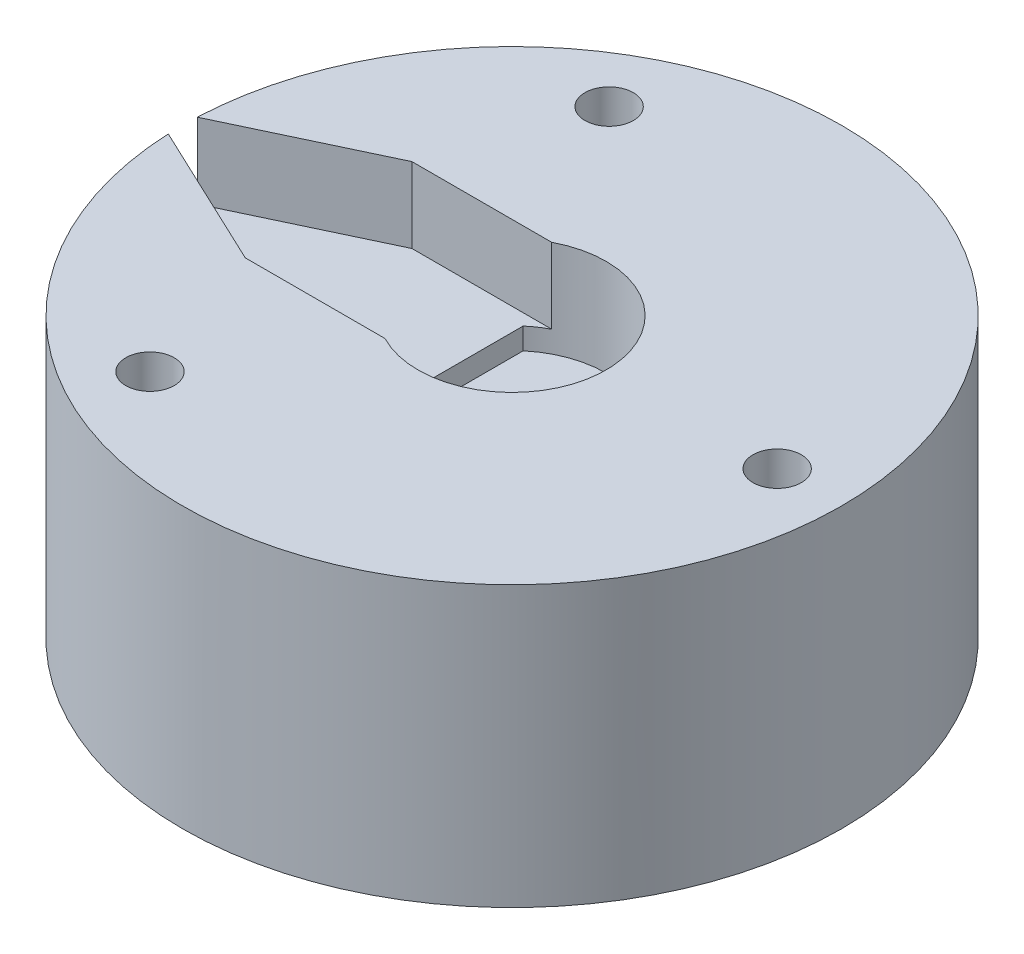
ISO-10303-21;
HEADER;
FILE_DESCRIPTION(('STEP AP214'),'2;1');
FILE_NAME('part.step','',(''),(''),'','','');
FILE_SCHEMA(('AUTOMOTIVE_DESIGN { 1 0 10303 214 1 1 1 1 }'));
ENDSEC;
DATA;
#1=APPLICATION_CONTEXT('core data for automotive mechanical design processes');
#2=APPLICATION_PROTOCOL_DEFINITION('international standard','automotive_design',2000,#1);
#3=PRODUCT_CONTEXT('',#1,'mechanical');
#4=PRODUCT('Part','Part','',(#3));
#5=PRODUCT_RELATED_PRODUCT_CATEGORY('part','',(#4));
#6=PRODUCT_DEFINITION_FORMATION('','',#4);
#7=PRODUCT_DEFINITION_CONTEXT('part definition',#1,'design');
#8=PRODUCT_DEFINITION('design','',#6,#7);
#9=PRODUCT_DEFINITION_SHAPE('','',#8);
#10=(LENGTH_UNIT() NAMED_UNIT(*) SI_UNIT(.MILLI.,.METRE.));
#11=(NAMED_UNIT(*) PLANE_ANGLE_UNIT() SI_UNIT($,.RADIAN.));
#12=(NAMED_UNIT(*) SI_UNIT($,.STERADIAN.) SOLID_ANGLE_UNIT());
#13=UNCERTAINTY_MEASURE_WITH_UNIT(LENGTH_MEASURE(1.E-05),#10,'distance_accuracy_value','');
#14=(GEOMETRIC_REPRESENTATION_CONTEXT(3) GLOBAL_UNCERTAINTY_ASSIGNED_CONTEXT((#13)) GLOBAL_UNIT_ASSIGNED_CONTEXT((#10,
#11,#12)) REPRESENTATION_CONTEXT('',''));
#15=CARTESIAN_POINT('',(0.,0.,0.));
#16=DIRECTION('',(0.,0.,1.));
#17=DIRECTION('',(1.,0.,0.));
#18=AXIS2_PLACEMENT_3D('',#15,#16,#17);
#19=CARTESIAN_POINT('',(0.,0.,0.));
#20=DIRECTION('',(0.,-1.,0.));
#21=DIRECTION('',(0.,0.,-1.));
#22=AXIS2_PLACEMENT_3D('',#19,#20,#21);
#23=CYLINDRICAL_SURFACE('',#22,30.65);
#24=CARTESIAN_POINT('',(0.,0.,0.));
#25=DIRECTION('',(0.,-1.,0.));
#26=DIRECTION('',(0.,0.,-1.));
#27=AXIS2_PLACEMENT_3D('',#24,#25,#26);
#28=CIRCLE('',#27,30.65);
#29=CARTESIAN_POINT('',(0.,0.,-30.65));
#30=VERTEX_POINT('',#29);
#31=EDGE_CURVE('E11',#30,#30,#28,.T.);
#32=ORIENTED_EDGE('',*,*,#31,.F.);
#33=EDGE_LOOP('',(#32));
#34=FACE_BOUND('',#33,.T.);
#35=CARTESIAN_POINT('',(0.,26.,0.));
#36=DIRECTION('',(0.,-1.,0.));
#37=DIRECTION('',(0.,0.,-1.));
#38=AXIS2_PLACEMENT_3D('',#35,#36,#37);
#39=CIRCLE('',#38,30.65);
#40=CARTESIAN_POINT('',(-30.6202547344074,26.,-1.35));
#41=VERTEX_POINT('',#40);
#42=CARTESIAN_POINT('',(-30.6202547344074,26.,1.35));
#43=VERTEX_POINT('',#42);
#44=EDGE_CURVE('E187',#41,#43,#39,.T.);
#45=ORIENTED_EDGE('',*,*,#44,.T.);
#46=DIRECTION('',(0.,1.,0.));
#47=VECTOR('',#46,1.);
#48=CARTESIAN_POINT('',(-30.6202547344074,19.,1.35));
#49=LINE('',#48,#47);
#50=CARTESIAN_POINT('',(-30.6202547344074,19.,1.35));
#51=VERTEX_POINT('',#50);
#52=EDGE_CURVE('E246',#51,#43,#49,.T.);
#53=ORIENTED_EDGE('',*,*,#52,.F.);
#54=CARTESIAN_POINT('',(0.,19.,0.));
#55=DIRECTION('',(0.,1.,0.));
#56=DIRECTION('',(0.,0.,1.));
#57=AXIS2_PLACEMENT_3D('',#54,#55,#56);
#58=CIRCLE('',#57,30.65);
#59=CARTESIAN_POINT('',(-30.6202547344074,19.,-1.35));
#60=VERTEX_POINT('',#59);
#61=EDGE_CURVE('E375',#60,#51,#58,.T.);
#62=ORIENTED_EDGE('',*,*,#61,.F.);
#63=DIRECTION('',(0.,1.,0.));
#64=VECTOR('',#63,1.);
#65=CARTESIAN_POINT('',(-30.6202547344074,19.,-1.35));
#66=LINE('',#65,#64);
#67=EDGE_CURVE('E247',#60,#41,#66,.T.);
#68=ORIENTED_EDGE('',*,*,#67,.T.);
#69=EDGE_LOOP('',(#45,#53,#62,#68));
#70=FACE_BOUND('',#69,.T.);
#71=ADVANCED_FACE('F36',(#34,#70),#23,.T.);
#72=CARTESIAN_POINT('',(5.65,17.,0.));
#73=DIRECTION('',(-1.,0.,0.));
#74=DIRECTION('',(0.,0.,1.));
#75=AXIS2_PLACEMENT_3D('',#72,#73,#74);
#76=PLANE('',#75);
#77=DIRECTION('',(0.,1.,0.));
#78=VECTOR('',#77,1.);
#79=CARTESIAN_POINT('',(5.65,17.,6.68131723539602));
#80=LINE('',#79,#78);
#81=CARTESIAN_POINT('',(5.65,17.,6.68131723539602));
#82=VERTEX_POINT('',#81);
#83=CARTESIAN_POINT('',(5.65,19.,6.68131723539602));
#84=VERTEX_POINT('',#83);
#85=EDGE_CURVE('E174',#82,#84,#80,.T.);
#86=ORIENTED_EDGE('',*,*,#85,.T.);
#87=DIRECTION('',(0.,0.,1.));
#88=VECTOR('',#87,1.);
#89=CARTESIAN_POINT('',(5.65,19.,0.));
#90=LINE('',#89,#88);
#91=CARTESIAN_POINT('',(5.65,19.,-6.68131723539603));
#92=VERTEX_POINT('',#91);
#93=EDGE_CURVE('E160',#92,#84,#90,.T.);
#94=ORIENTED_EDGE('',*,*,#93,.F.);
#95=DIRECTION('',(0.,1.,0.));
#96=VECTOR('',#95,1.);
#97=CARTESIAN_POINT('',(5.65,17.,-6.68131723539603));
#98=LINE('',#97,#96);
#99=CARTESIAN_POINT('',(5.65,17.,-6.68131723539603));
#100=VERTEX_POINT('',#99);
#101=EDGE_CURVE('E176',#100,#92,#98,.T.);
#102=ORIENTED_EDGE('',*,*,#101,.F.);
#103=DIRECTION('',(0.,0.,1.));
#104=VECTOR('',#103,1.);
#105=CARTESIAN_POINT('',(5.65,17.,0.));
#106=LINE('',#105,#104);
#107=EDGE_CURVE('E182',#100,#82,#106,.T.);
#108=ORIENTED_EDGE('',*,*,#107,.T.);
#109=EDGE_LOOP('',(#86,#94,#102,#108));
#110=FACE_BOUND('',#109,.T.);
#111=ADVANCED_FACE('F180',(#110),#76,.T.);
#112=CARTESIAN_POINT('',(-5.65,17.,0.));
#113=DIRECTION('',(-1.,0.,0.));
#114=DIRECTION('',(0.,0.,1.));
#115=AXIS2_PLACEMENT_3D('',#112,#113,#114);
#116=PLANE('',#115);
#117=DIRECTION('',(0.,0.,1.));
#118=VECTOR('',#117,1.);
#119=CARTESIAN_POINT('',(-5.65,19.,0.));
#120=LINE('',#119,#118);
#121=CARTESIAN_POINT('',(-5.65,19.,-6.68131723539603));
#122=VERTEX_POINT('',#121);
#123=CARTESIAN_POINT('',(-5.65,19.,6.68131723539603));
#124=VERTEX_POINT('',#123);
#125=EDGE_CURVE('E50',#122,#124,#120,.T.);
#126=ORIENTED_EDGE('',*,*,#125,.T.);
#127=DIRECTION('',(0.,1.,0.));
#128=VECTOR('',#127,1.);
#129=CARTESIAN_POINT('',(-5.65,17.,6.68131723539603));
#130=LINE('',#129,#128);
#131=CARTESIAN_POINT('',(-5.65,17.,6.68131723539603));
#132=VERTEX_POINT('',#131);
#133=EDGE_CURVE('E184',#132,#124,#130,.T.);
#134=ORIENTED_EDGE('',*,*,#133,.F.);
#135=DIRECTION('',(0.,0.,1.));
#136=VECTOR('',#135,1.);
#137=CARTESIAN_POINT('',(-5.65,17.,0.));
#138=LINE('',#137,#136);
#139=CARTESIAN_POINT('',(-5.65,17.,-6.68131723539603));
#140=VERTEX_POINT('',#139);
#141=EDGE_CURVE('E338',#140,#132,#138,.T.);
#142=ORIENTED_EDGE('',*,*,#141,.F.);
#143=DIRECTION('',(0.,1.,0.));
#144=VECTOR('',#143,1.);
#145=CARTESIAN_POINT('',(-5.65,17.,-6.68131723539603));
#146=LINE('',#145,#144);
#147=EDGE_CURVE('E190',#140,#122,#146,.T.);
#148=ORIENTED_EDGE('',*,*,#147,.T.);
#149=EDGE_LOOP('',(#126,#134,#142,#148));
#150=FACE_BOUND('',#149,.T.);
#151=ADVANCED_FACE('F229',(#150),#116,.F.);
#152=CARTESIAN_POINT('',(0.,26.,0.));
#153=DIRECTION('',(0.,1.,0.));
#154=DIRECTION('',(0.,0.,1.));
#155=AXIS2_PLACEMENT_3D('',#152,#153,#154);
#156=PLANE('',#155);
#157=CARTESIAN_POINT('',(-12.3249999999998,26.,-21.3475262032865));
#158=DIRECTION('',(0.,1.,0.));
#159=DIRECTION('',(0.,0.,1.));
#160=AXIS2_PLACEMENT_3D('',#157,#158,#159);
#161=CIRCLE('',#160,2.25);
#162=CARTESIAN_POINT('',(-12.3249999999998,26.,-19.0975262032865));
#163=VERTEX_POINT('',#162);
#164=EDGE_CURVE('E380',#163,#163,#161,.T.);
#165=ORIENTED_EDGE('',*,*,#164,.F.);
#166=EDGE_LOOP('',(#165));
#167=FACE_BOUND('',#166,.T.);
#168=CARTESIAN_POINT('',(24.65,26.,0.));
#169=DIRECTION('',(0.,1.,0.));
#170=DIRECTION('',(0.,0.,1.));
#171=AXIS2_PLACEMENT_3D('',#168,#169,#170);
#172=CIRCLE('',#171,2.25);
#173=CARTESIAN_POINT('',(24.65,26.,2.25));
#174=VERTEX_POINT('',#173);
#175=EDGE_CURVE('E384',#174,#174,#172,.T.);
#176=ORIENTED_EDGE('',*,*,#175,.F.);
#177=EDGE_LOOP('',(#176));
#178=FACE_BOUND('',#177,.T.);
#179=CARTESIAN_POINT('',(-12.3250000000001,26.,21.3475262032864));
#180=DIRECTION('',(0.,1.,0.));
#181=DIRECTION('',(0.,0.,1.));
#182=AXIS2_PLACEMENT_3D('',#179,#180,#181);
#183=CIRCLE('',#182,2.25);
#184=CARTESIAN_POINT('',(-12.3250000000001,26.,23.5975262032864));
#185=VERTEX_POINT('',#184);
#186=EDGE_CURVE('E392',#185,#185,#183,.T.);
#187=ORIENTED_EDGE('',*,*,#186,.F.);
#188=EDGE_LOOP('',(#187));
#189=FACE_BOUND('',#188,.T.);
#190=CARTESIAN_POINT('',(0.,26.,0.));
#191=DIRECTION('',(0.,1.,0.));
#192=DIRECTION('',(0.,0.,1.));
#193=AXIS2_PLACEMENT_3D('',#190,#191,#192);
#194=CIRCLE('',#193,8.75);
#195=CARTESIAN_POINT('',(-4.06201920231798,26.,7.75));
#196=VERTEX_POINT('',#195);
#197=CARTESIAN_POINT('',(-4.06201920231798,26.,-7.75));
#198=VERTEX_POINT('',#197);
#199=EDGE_CURVE('E193',#196,#198,#194,.T.);
#200=ORIENTED_EDGE('',*,*,#199,.F.);
#201=DIRECTION('',(1.,0.,0.));
#202=VECTOR('',#201,1.);
#203=CARTESIAN_POINT('',(0.,26.,7.75));
#204=LINE('',#203,#202);
#205=CARTESIAN_POINT('',(-17.062019202318,26.,7.75));
#206=VERTEX_POINT('',#205);
#207=EDGE_CURVE('E257',#206,#196,#204,.T.);
#208=ORIENTED_EDGE('',*,*,#207,.F.);
#209=DIRECTION('',(-0.904313023333706,0.,-0.426869951892907));
#210=VECTOR('',#209,1.);
#211=CARTESIAN_POINT('',(-6.10069270130348,26.,12.9241607114331));
#212=LINE('',#211,#210);
#213=EDGE_CURVE('E255',#206,#43,#212,.T.);
#214=ORIENTED_EDGE('',*,*,#213,.T.);
#215=ORIENTED_EDGE('',*,*,#44,.F.);
#216=DIRECTION('',(-0.904313023333706,0.,0.426869951892907));
#217=VECTOR('',#216,1.);
#218=CARTESIAN_POINT('',(-6.10069270130348,26.,-12.9241607114331));
#219=LINE('',#218,#217);
#220=CARTESIAN_POINT('',(-17.062019202318,26.,-7.75));
#221=VERTEX_POINT('',#220);
#222=EDGE_CURVE('E252',#221,#41,#219,.T.);
#223=ORIENTED_EDGE('',*,*,#222,.F.);
#224=DIRECTION('',(1.,0.,0.));
#225=VECTOR('',#224,1.);
#226=CARTESIAN_POINT('',(0.,26.,-7.75));
#227=LINE('',#226,#225);
#228=EDGE_CURVE('E262',#221,#198,#227,.T.);
#229=ORIENTED_EDGE('',*,*,#228,.T.);
#230=EDGE_LOOP('',(#200,#208,#214,#215,#223,#229));
#231=FACE_BOUND('',#230,.T.);
#232=ADVANCED_FACE('F221',(#167,#178,#189,#231),#156,.T.);
#233=CARTESIAN_POINT('',(30.65,0.,0.));
#234=DIRECTION('',(0.,-1.,0.));
#235=DIRECTION('',(0.,0.,-1.));
#236=AXIS2_PLACEMENT_3D('',#233,#234,#235);
#237=PLANE('',#236);
#238=CARTESIAN_POINT('',(-12.3249999999998,0.,-21.3475262032865));
#239=DIRECTION('',(0.,1.,0.));
#240=DIRECTION('',(0.,0.,1.));
#241=AXIS2_PLACEMENT_3D('',#238,#239,#240);
#242=CIRCLE('',#241,2.25);
#243=CARTESIAN_POINT('',(-12.3249999999998,0.,-19.0975262032865));
#244=VERTEX_POINT('',#243);
#245=EDGE_CURVE('E378',#244,#244,#242,.T.);
#246=ORIENTED_EDGE('',*,*,#245,.T.);
#247=EDGE_LOOP('',(#246));
#248=FACE_BOUND('',#247,.T.);
#249=CARTESIAN_POINT('',(24.65,0.,0.));
#250=DIRECTION('',(0.,1.,0.));
#251=DIRECTION('',(0.,0.,1.));
#252=AXIS2_PLACEMENT_3D('',#249,#250,#251);
#253=CIRCLE('',#252,2.25);
#254=CARTESIAN_POINT('',(24.65,0.,2.25));
#255=VERTEX_POINT('',#254);
#256=EDGE_CURVE('E389',#255,#255,#253,.T.);
#257=ORIENTED_EDGE('',*,*,#256,.T.);
#258=EDGE_LOOP('',(#257));
#259=FACE_BOUND('',#258,.T.);
#260=CARTESIAN_POINT('',(-12.3250000000001,0.,21.3475262032864));
#261=DIRECTION('',(0.,1.,0.));
#262=DIRECTION('',(0.,0.,1.));
#263=AXIS2_PLACEMENT_3D('',#260,#261,#262);
#264=CIRCLE('',#263,2.25);
#265=CARTESIAN_POINT('',(-12.3250000000001,0.,23.5975262032864));
#266=VERTEX_POINT('',#265);
#267=EDGE_CURVE('E395',#266,#266,#264,.T.);
#268=ORIENTED_EDGE('',*,*,#267,.T.);
#269=EDGE_LOOP('',(#268));
#270=FACE_BOUND('',#269,.T.);
#271=ORIENTED_EDGE('',*,*,#31,.T.);
#272=EDGE_LOOP('',(#271));
#273=FACE_BOUND('',#272,.T.);
#274=CARTESIAN_POINT('',(0.,0.,0.));
#275=DIRECTION('',(0.,-1.,0.));
#276=DIRECTION('',(0.,0.,-1.));
#277=AXIS2_PLACEMENT_3D('',#274,#275,#276);
#278=CIRCLE('',#277,18.65);
#279=CARTESIAN_POINT('',(0.,0.,-18.65));
#280=VERTEX_POINT('',#279);
#281=EDGE_CURVE('E43',#280,#280,#278,.T.);
#282=ORIENTED_EDGE('',*,*,#281,.F.);
#283=EDGE_LOOP('',(#282));
#284=FACE_BOUND('',#283,.T.);
#285=ADVANCED_FACE('F219',(#248,#259,#270,#273,#284),#237,.T.);
#286=CARTESIAN_POINT('',(0.,0.,0.));
#287=DIRECTION('',(0.,-1.,0.));
#288=DIRECTION('',(0.,0.,-1.));
#289=AXIS2_PLACEMENT_3D('',#286,#287,#288);
#290=CYLINDRICAL_SURFACE('',#289,18.65);
#291=ORIENTED_EDGE('',*,*,#281,.T.);
#292=EDGE_LOOP('',(#291));
#293=FACE_BOUND('',#292,.T.);
#294=CARTESIAN_POINT('',(0.,7.,0.));
#295=DIRECTION('',(0.,-1.,0.));
#296=DIRECTION('',(0.,0.,-1.));
#297=AXIS2_PLACEMENT_3D('',#294,#295,#296);
#298=CIRCLE('',#297,18.65);
#299=CARTESIAN_POINT('',(0.,7.,-18.65));
#300=VERTEX_POINT('',#299);
#301=EDGE_CURVE('E211',#300,#300,#298,.T.);
#302=ORIENTED_EDGE('',*,*,#301,.F.);
#303=EDGE_LOOP('',(#302));
#304=FACE_BOUND('',#303,.T.);
#305=ADVANCED_FACE('F216',(#293,#304),#290,.F.);
#306=CARTESIAN_POINT('',(18.65,7.,0.));
#307=DIRECTION('',(0.,-1.,0.));
#308=DIRECTION('',(0.,0.,-1.));
#309=AXIS2_PLACEMENT_3D('',#306,#307,#308);
#310=PLANE('',#309);
#311=ORIENTED_EDGE('',*,*,#301,.T.);
#312=EDGE_LOOP('',(#311));
#313=FACE_BOUND('',#312,.T.);
#314=CARTESIAN_POINT('',(0.,7.,0.));
#315=DIRECTION('',(0.,-1.,0.));
#316=DIRECTION('',(0.,0.,-1.));
#317=AXIS2_PLACEMENT_3D('',#314,#315,#316);
#318=CIRCLE('',#317,17.15);
#319=CARTESIAN_POINT('',(0.,7.,-17.15));
#320=VERTEX_POINT('',#319);
#321=EDGE_CURVE('E208',#320,#320,#318,.T.);
#322=ORIENTED_EDGE('',*,*,#321,.F.);
#323=EDGE_LOOP('',(#322));
#324=FACE_BOUND('',#323,.T.);
#325=ADVANCED_FACE('F227',(#313,#324),#310,.T.);
#326=CARTESIAN_POINT('',(0.,0.,0.));
#327=DIRECTION('',(0.,-1.,0.));
#328=DIRECTION('',(0.,0.,-1.));
#329=AXIS2_PLACEMENT_3D('',#326,#327,#328);
#330=CYLINDRICAL_SURFACE('',#329,17.15);
#331=ORIENTED_EDGE('',*,*,#321,.T.);
#332=EDGE_LOOP('',(#331));
#333=FACE_BOUND('',#332,.T.);
#334=CARTESIAN_POINT('',(0.,13.5,0.));
#335=DIRECTION('',(0.,-1.,0.));
#336=DIRECTION('',(0.,0.,-1.));
#337=AXIS2_PLACEMENT_3D('',#334,#335,#336);
#338=CIRCLE('',#337,17.15);
#339=CARTESIAN_POINT('',(0.,13.5,-17.15));
#340=VERTEX_POINT('',#339);
#341=EDGE_CURVE('E205',#340,#340,#338,.T.);
#342=ORIENTED_EDGE('',*,*,#341,.F.);
#343=EDGE_LOOP('',(#342));
#344=FACE_BOUND('',#343,.T.);
#345=ADVANCED_FACE('F475',(#333,#344),#330,.F.);
#346=CARTESIAN_POINT('',(17.15,13.5,0.));
#347=DIRECTION('',(0.,-1.,0.));
#348=DIRECTION('',(0.,0.,-1.));
#349=AXIS2_PLACEMENT_3D('',#346,#347,#348);
#350=PLANE('',#349);
#351=ORIENTED_EDGE('',*,*,#341,.T.);
#352=EDGE_LOOP('',(#351));
#353=FACE_BOUND('',#352,.T.);
#354=CARTESIAN_POINT('',(0.,13.5,0.));
#355=DIRECTION('',(0.,-1.,0.));
#356=DIRECTION('',(0.,0.,-1.));
#357=AXIS2_PLACEMENT_3D('',#354,#355,#356);
#358=CIRCLE('',#357,3.65);
#359=CARTESIAN_POINT('',(0.,13.5,-3.65));
#360=VERTEX_POINT('',#359);
#361=EDGE_CURVE('E201',#360,#360,#358,.T.);
#362=ORIENTED_EDGE('',*,*,#361,.F.);
#363=EDGE_LOOP('',(#362));
#364=FACE_BOUND('',#363,.T.);
#365=ADVANCED_FACE('F471',(#353,#364),#350,.T.);
#366=CARTESIAN_POINT('',(0.,0.,0.));
#367=DIRECTION('',(0.,-1.,0.));
#368=DIRECTION('',(0.,0.,-1.));
#369=AXIS2_PLACEMENT_3D('',#366,#367,#368);
#370=CYLINDRICAL_SURFACE('',#369,3.65);
#371=ORIENTED_EDGE('',*,*,#361,.T.);
#372=EDGE_LOOP('',(#371));
#373=FACE_BOUND('',#372,.T.);
#374=CARTESIAN_POINT('',(0.,17.,0.));
#375=DIRECTION('',(0.,-1.,0.));
#376=DIRECTION('',(0.,0.,-1.));
#377=AXIS2_PLACEMENT_3D('',#374,#375,#376);
#378=CIRCLE('',#377,3.65);
#379=CARTESIAN_POINT('',(0.,17.,-3.65));
#380=VERTEX_POINT('',#379);
#381=EDGE_CURVE('E183',#380,#380,#378,.T.);
#382=ORIENTED_EDGE('',*,*,#381,.F.);
#383=EDGE_LOOP('',(#382));
#384=FACE_BOUND('',#383,.T.);
#385=ADVANCED_FACE('F464',(#373,#384),#370,.F.);
#386=CARTESIAN_POINT('',(0.,17.,0.));
#387=DIRECTION('',(0.,1.,0.));
#388=DIRECTION('',(0.,0.,1.));
#389=AXIS2_PLACEMENT_3D('',#386,#387,#388);
#390=PLANE('',#389);
#391=CARTESIAN_POINT('',(0.879999999999998,17.,8.08223360216716));
#392=DIRECTION('',(0.,1.,0.));
#393=DIRECTION('',(0.,0.,1.));
#394=AXIS2_PLACEMENT_3D('',#391,#392,#393);
#395=CIRCLE('',#394,0.620000000000004);
#396=CARTESIAN_POINT('',(0.94710947109471,17.,8.69859090024141));
#397=VERTEX_POINT('',#396);
#398=CARTESIAN_POINT('',(1.5,17.,8.08223360216716));
#399=VERTEX_POINT('',#398);
#400=EDGE_CURVE('E177',#397,#399,#395,.T.);
#401=ORIENTED_EDGE('',*,*,#400,.F.);
#402=CARTESIAN_POINT('',(0.,17.,0.));
#403=DIRECTION('',(0.,1.,0.));
#404=DIRECTION('',(0.,0.,1.));
#405=AXIS2_PLACEMENT_3D('',#402,#403,#404);
#406=CIRCLE('',#405,8.75);
#407=EDGE_CURVE('E340',#397,#82,#406,.T.);
#408=ORIENTED_EDGE('',*,*,#407,.T.);
#409=ORIENTED_EDGE('',*,*,#107,.F.);
#410=CARTESIAN_POINT('',(0.,17.,0.));
#411=DIRECTION('',(0.,1.,0.));
#412=DIRECTION('',(0.,0.,1.));
#413=AXIS2_PLACEMENT_3D('',#410,#411,#412);
#414=CIRCLE('',#413,8.75);
#415=EDGE_CURVE('E335',#100,#140,#414,.T.);
#416=ORIENTED_EDGE('',*,*,#415,.T.);
#417=ORIENTED_EDGE('',*,*,#141,.T.);
#418=CARTESIAN_POINT('',(-0.947109471094709,17.,8.69859090024141));
#419=VERTEX_POINT('',#418);
#420=EDGE_CURVE('E199',#132,#419,#406,.T.);
#421=ORIENTED_EDGE('',*,*,#420,.T.);
#422=CARTESIAN_POINT('',(-0.879999999999998,17.,8.08223360216716));
#423=DIRECTION('',(0.,1.,0.));
#424=DIRECTION('',(0.,0.,-1.));
#425=AXIS2_PLACEMENT_3D('',#422,#423,#424);
#426=CIRCLE('',#425,0.620000000000004);
#427=CARTESIAN_POINT('',(-1.5,17.,8.08223360216716));
#428=VERTEX_POINT('',#427);
#429=EDGE_CURVE('E58',#428,#419,#426,.T.);
#430=ORIENTED_EDGE('',*,*,#429,.F.);
#431=DIRECTION('',(0.,0.,1.));
#432=VECTOR('',#431,1.);
#433=CARTESIAN_POINT('',(-1.5,17.,7.78));
#434=LINE('',#433,#432);
#435=CARTESIAN_POINT('',(-1.5,17.,7.78));
#436=VERTEX_POINT('',#435);
#437=EDGE_CURVE('E315',#436,#428,#434,.T.);
#438=ORIENTED_EDGE('',*,*,#437,.F.);
#439=CARTESIAN_POINT('',(-0.920000000000002,17.,7.78));
#440=DIRECTION('',(0.,1.,0.));
#441=DIRECTION('',(0.,0.,-1.));
#442=AXIS2_PLACEMENT_3D('',#439,#440,#441);
#443=CIRCLE('',#442,0.579999999999998);
#444=CARTESIAN_POINT('',(-0.920000000000002,17.,7.2));
#445=VERTEX_POINT('',#444);
#446=EDGE_CURVE('E312',#445,#436,#443,.T.);
#447=ORIENTED_EDGE('',*,*,#446,.F.);
#448=DIRECTION('',(-1.,0.,0.));
#449=VECTOR('',#448,1.);
#450=CARTESIAN_POINT('',(-0.920000000000002,17.,7.2));
#451=LINE('',#450,#449);
#452=CARTESIAN_POINT('',(0.920000000000002,17.,7.2));
#453=VERTEX_POINT('',#452);
#454=EDGE_CURVE('E309',#453,#445,#451,.T.);
#455=ORIENTED_EDGE('',*,*,#454,.F.);
#456=CARTESIAN_POINT('',(0.920000000000002,17.,7.78));
#457=DIRECTION('',(0.,1.,0.));
#458=DIRECTION('',(0.,0.,1.));
#459=AXIS2_PLACEMENT_3D('',#456,#457,#458);
#460=CIRCLE('',#459,0.579999999999998);
#461=CARTESIAN_POINT('',(1.5,17.,7.78));
#462=VERTEX_POINT('',#461);
#463=EDGE_CURVE('E306',#462,#453,#460,.T.);
#464=ORIENTED_EDGE('',*,*,#463,.F.);
#465=DIRECTION('',(0.,0.,-1.));
#466=VECTOR('',#465,1.);
#467=CARTESIAN_POINT('',(1.5,17.,7.78));
#468=LINE('',#467,#466);
#469=EDGE_CURVE('E303',#399,#462,#468,.T.);
#470=ORIENTED_EDGE('',*,*,#469,.F.);
#471=EDGE_LOOP('',(#401,#408,#409,#416,#417,#421,#430,#438,#447,#455,#464,#470));
#472=FACE_BOUND('',#471,.T.);
#473=ORIENTED_EDGE('',*,*,#381,.T.);
#474=EDGE_LOOP('',(#473));
#475=FACE_BOUND('',#474,.T.);
#476=ADVANCED_FACE('F345',(#472,#475),#390,.T.);
#477=CARTESIAN_POINT('',(0.,17.,0.));
#478=DIRECTION('',(0.,1.,0.));
#479=DIRECTION('',(0.,0.,1.));
#480=AXIS2_PLACEMENT_3D('',#477,#478,#479);
#481=CYLINDRICAL_SURFACE('',#480,8.75);
#482=CARTESIAN_POINT('',(0.,19.,0.));
#483=DIRECTION('',(0.,1.,0.));
#484=DIRECTION('',(0.,0.,1.));
#485=AXIS2_PLACEMENT_3D('',#482,#483,#484);
#486=CIRCLE('',#485,8.75);
#487=CARTESIAN_POINT('',(-4.06201920231798,19.,7.75));
#488=VERTEX_POINT('',#487);
#489=EDGE_CURVE('E358',#124,#488,#486,.T.);
#490=ORIENTED_EDGE('',*,*,#489,.T.);
#491=DIRECTION('',(0.,1.,0.));
#492=VECTOR('',#491,1.);
#493=CARTESIAN_POINT('',(-4.06201920231798,19.,7.75));
#494=LINE('',#493,#492);
#495=EDGE_CURVE('E167',#488,#196,#494,.T.);
#496=ORIENTED_EDGE('',*,*,#495,.T.);
#497=ORIENTED_EDGE('',*,*,#199,.T.);
#498=DIRECTION('',(0.,1.,0.));
#499=VECTOR('',#498,1.);
#500=CARTESIAN_POINT('',(-4.06201920231798,19.,-7.75));
#501=LINE('',#500,#499);
#502=CARTESIAN_POINT('',(-4.06201920231798,19.,-7.75));
#503=VERTEX_POINT('',#502);
#504=EDGE_CURVE('E274',#503,#198,#501,.T.);
#505=ORIENTED_EDGE('',*,*,#504,.F.);
#506=EDGE_CURVE('E260',#503,#122,#486,.T.);
#507=ORIENTED_EDGE('',*,*,#506,.T.);
#508=ORIENTED_EDGE('',*,*,#147,.F.);
#509=ORIENTED_EDGE('',*,*,#415,.F.);
#510=ORIENTED_EDGE('',*,*,#101,.T.);
#511=CARTESIAN_POINT('',(0.,19.,0.));
#512=DIRECTION('',(0.,1.,0.));
#513=DIRECTION('',(0.,0.,1.));
#514=AXIS2_PLACEMENT_3D('',#511,#512,#513);
#515=CIRCLE('',#514,8.75);
#516=EDGE_CURVE('E163',#84,#92,#515,.T.);
#517=ORIENTED_EDGE('',*,*,#516,.F.);
#518=ORIENTED_EDGE('',*,*,#85,.F.);
#519=ORIENTED_EDGE('',*,*,#407,.F.);
#520=DIRECTION('',(0.,1.,0.));
#521=VECTOR('',#520,1.);
#522=CARTESIAN_POINT('',(0.94710947109471,15.,8.69859090024141));
#523=LINE('',#522,#521);
#524=CARTESIAN_POINT('',(0.94710947109471,15.,8.69859090024141));
#525=VERTEX_POINT('',#524);
#526=EDGE_CURVE('E319',#525,#397,#523,.T.);
#527=ORIENTED_EDGE('',*,*,#526,.F.);
#528=CARTESIAN_POINT('',(0.,15.,0.));
#529=DIRECTION('',(0.,1.,0.));
#530=DIRECTION('',(0.,0.,1.));
#531=AXIS2_PLACEMENT_3D('',#528,#529,#530);
#532=CIRCLE('',#531,8.75);
#533=CARTESIAN_POINT('',(-0.947109471094712,15.,8.69859090024141));
#534=VERTEX_POINT('',#533);
#535=EDGE_CURVE('E297',#534,#525,#532,.T.);
#536=ORIENTED_EDGE('',*,*,#535,.F.);
#537=DIRECTION('',(0.,1.,0.));
#538=VECTOR('',#537,1.);
#539=CARTESIAN_POINT('',(-0.947109471094712,15.,8.69859090024141));
#540=LINE('',#539,#538);
#541=EDGE_CURVE('E321',#534,#419,#540,.T.);
#542=ORIENTED_EDGE('',*,*,#541,.T.);
#543=ORIENTED_EDGE('',*,*,#420,.F.);
#544=ORIENTED_EDGE('',*,*,#133,.T.);
#545=EDGE_LOOP('',(#490,#496,#497,#505,#507,#508,#509,#510,#517,#518,#519,#527,#536,#542,#543,#544));
#546=FACE_BOUND('',#545,.T.);
#547=ADVANCED_FACE('F172',(#546),#481,.F.);
#548=CARTESIAN_POINT('',(0.879999999999998,15.,8.08223360216716));
#549=DIRECTION('',(0.,1.,0.));
#550=DIRECTION('',(0.,0.,1.));
#551=AXIS2_PLACEMENT_3D('',#548,#549,#550);
#552=CYLINDRICAL_SURFACE('',#551,0.620000000000004);
#553=ORIENTED_EDGE('',*,*,#400,.T.);
#554=DIRECTION('',(0.,1.,0.));
#555=VECTOR('',#554,1.);
#556=CARTESIAN_POINT('',(1.5,15.,8.08223360216716));
#557=LINE('',#556,#555);
#558=CARTESIAN_POINT('',(1.5,15.,8.08223360216716));
#559=VERTEX_POINT('',#558);
#560=EDGE_CURVE('E300',#559,#399,#557,.T.);
#561=ORIENTED_EDGE('',*,*,#560,.F.);
#562=CARTESIAN_POINT('',(0.879999999999998,15.,8.08223360216716));
#563=DIRECTION('',(0.,1.,0.));
#564=DIRECTION('',(0.,0.,1.));
#565=AXIS2_PLACEMENT_3D('',#562,#563,#564);
#566=CIRCLE('',#565,0.620000000000004);
#567=EDGE_CURVE('E276',#525,#559,#566,.T.);
#568=ORIENTED_EDGE('',*,*,#567,.F.);
#569=ORIENTED_EDGE('',*,*,#526,.T.);
#570=EDGE_LOOP('',(#553,#561,#568,#569));
#571=FACE_BOUND('',#570,.T.);
#572=ADVANCED_FACE('F351',(#571),#552,.F.);
#573=CARTESIAN_POINT('',(-0.879999999999998,15.,8.08223360216716));
#574=DIRECTION('',(0.,1.,0.));
#575=DIRECTION('',(0.,0.,1.));
#576=AXIS2_PLACEMENT_3D('',#573,#574,#575);
#577=CYLINDRICAL_SURFACE('',#576,0.620000000000004);
#578=ORIENTED_EDGE('',*,*,#429,.T.);
#579=ORIENTED_EDGE('',*,*,#541,.F.);
#580=CARTESIAN_POINT('',(-0.879999999999998,15.,8.08223360216716));
#581=DIRECTION('',(0.,1.,0.));
#582=DIRECTION('',(0.,0.,-1.));
#583=AXIS2_PLACEMENT_3D('',#580,#581,#582);
#584=CIRCLE('',#583,0.620000000000004);
#585=CARTESIAN_POINT('',(-1.5,15.,8.08223360216716));
#586=VERTEX_POINT('',#585);
#587=EDGE_CURVE('E294',#586,#534,#584,.T.);
#588=ORIENTED_EDGE('',*,*,#587,.F.);
#589=DIRECTION('',(0.,1.,0.));
#590=VECTOR('',#589,1.);
#591=CARTESIAN_POINT('',(-1.5,15.,8.08223360216716));
#592=LINE('',#591,#590);
#593=EDGE_CURVE('E323',#586,#428,#592,.T.);
#594=ORIENTED_EDGE('',*,*,#593,.T.);
#595=EDGE_LOOP('',(#578,#579,#588,#594));
#596=FACE_BOUND('',#595,.T.);
#597=ADVANCED_FACE('F357',(#596),#577,.F.);
#598=CARTESIAN_POINT('',(-1.5,15.,7.78));
#599=DIRECTION('',(-1.,0.,0.));
#600=DIRECTION('',(0.,0.,1.));
#601=AXIS2_PLACEMENT_3D('',#598,#599,#600);
#602=PLANE('',#601);
#603=ORIENTED_EDGE('',*,*,#437,.T.);
#604=ORIENTED_EDGE('',*,*,#593,.F.);
#605=DIRECTION('',(0.,0.,1.));
#606=VECTOR('',#605,1.);
#607=CARTESIAN_POINT('',(-1.5,15.,7.78));
#608=LINE('',#607,#606);
#609=CARTESIAN_POINT('',(-1.5,15.,7.78));
#610=VERTEX_POINT('',#609);
#611=EDGE_CURVE('E291',#610,#586,#608,.T.);
#612=ORIENTED_EDGE('',*,*,#611,.F.);
#613=DIRECTION('',(0.,1.,0.));
#614=VECTOR('',#613,1.);
#615=CARTESIAN_POINT('',(-1.5,15.,7.78));
#616=LINE('',#615,#614);
#617=EDGE_CURVE('E325',#610,#436,#616,.T.);
#618=ORIENTED_EDGE('',*,*,#617,.T.);
#619=EDGE_LOOP('',(#603,#604,#612,#618));
#620=FACE_BOUND('',#619,.T.);
#621=ADVANCED_FACE('F441',(#620),#602,.F.);
#622=CARTESIAN_POINT('',(-0.920000000000002,15.,7.78));
#623=DIRECTION('',(0.,1.,0.));
#624=DIRECTION('',(0.,0.,1.));
#625=AXIS2_PLACEMENT_3D('',#622,#623,#624);
#626=CYLINDRICAL_SURFACE('',#625,0.579999999999998);
#627=ORIENTED_EDGE('',*,*,#446,.T.);
#628=ORIENTED_EDGE('',*,*,#617,.F.);
#629=CARTESIAN_POINT('',(-0.920000000000002,15.,7.78));
#630=DIRECTION('',(0.,1.,0.));
#631=DIRECTION('',(0.,0.,-1.));
#632=AXIS2_PLACEMENT_3D('',#629,#630,#631);
#633=CIRCLE('',#632,0.579999999999998);
#634=CARTESIAN_POINT('',(-0.920000000000002,15.,7.2));
#635=VERTEX_POINT('',#634);
#636=EDGE_CURVE('E288',#635,#610,#633,.T.);
#637=ORIENTED_EDGE('',*,*,#636,.F.);
#638=DIRECTION('',(0.,1.,0.));
#639=VECTOR('',#638,1.);
#640=CARTESIAN_POINT('',(-0.920000000000002,15.,7.2));
#641=LINE('',#640,#639);
#642=EDGE_CURVE('E327',#635,#445,#641,.T.);
#643=ORIENTED_EDGE('',*,*,#642,.T.);
#644=EDGE_LOOP('',(#627,#628,#637,#643));
#645=FACE_BOUND('',#644,.T.);
#646=ADVANCED_FACE('F444',(#645),#626,.F.);
#647=CARTESIAN_POINT('',(-0.920000000000002,15.,7.2));
#648=DIRECTION('',(0.,0.,-1.));
#649=DIRECTION('',(-1.,0.,0.));
#650=AXIS2_PLACEMENT_3D('',#647,#648,#649);
#651=PLANE('',#650);
#652=ORIENTED_EDGE('',*,*,#454,.T.);
#653=ORIENTED_EDGE('',*,*,#642,.F.);
#654=DIRECTION('',(-1.,0.,0.));
#655=VECTOR('',#654,1.);
#656=CARTESIAN_POINT('',(-0.920000000000002,15.,7.2));
#657=LINE('',#656,#655);
#658=CARTESIAN_POINT('',(0.920000000000002,15.,7.2));
#659=VERTEX_POINT('',#658);
#660=EDGE_CURVE('E285',#659,#635,#657,.T.);
#661=ORIENTED_EDGE('',*,*,#660,.F.);
#662=DIRECTION('',(0.,1.,0.));
#663=VECTOR('',#662,1.);
#664=CARTESIAN_POINT('',(0.920000000000002,15.,7.2));
#665=LINE('',#664,#663);
#666=EDGE_CURVE('E329',#659,#453,#665,.T.);
#667=ORIENTED_EDGE('',*,*,#666,.T.);
#668=EDGE_LOOP('',(#652,#653,#661,#667));
#669=FACE_BOUND('',#668,.T.);
#670=ADVANCED_FACE('F448',(#669),#651,.F.);
#671=CARTESIAN_POINT('',(0.920000000000002,15.,7.78));
#672=DIRECTION('',(0.,1.,0.));
#673=DIRECTION('',(0.,0.,1.));
#674=AXIS2_PLACEMENT_3D('',#671,#672,#673);
#675=CYLINDRICAL_SURFACE('',#674,0.579999999999998);
#676=ORIENTED_EDGE('',*,*,#463,.T.);
#677=ORIENTED_EDGE('',*,*,#666,.F.);
#678=CARTESIAN_POINT('',(0.920000000000002,15.,7.78));
#679=DIRECTION('',(0.,1.,0.));
#680=DIRECTION('',(0.,0.,1.));
#681=AXIS2_PLACEMENT_3D('',#678,#679,#680);
#682=CIRCLE('',#681,0.579999999999998);
#683=CARTESIAN_POINT('',(1.5,15.,7.78));
#684=VERTEX_POINT('',#683);
#685=EDGE_CURVE('E282',#684,#659,#682,.T.);
#686=ORIENTED_EDGE('',*,*,#685,.F.);
#687=DIRECTION('',(0.,1.,0.));
#688=VECTOR('',#687,1.);
#689=CARTESIAN_POINT('',(1.5,15.,7.78));
#690=LINE('',#689,#688);
#691=EDGE_CURVE('E331',#684,#462,#690,.T.);
#692=ORIENTED_EDGE('',*,*,#691,.T.);
#693=EDGE_LOOP('',(#676,#677,#686,#692));
#694=FACE_BOUND('',#693,.T.);
#695=ADVANCED_FACE('F452',(#694),#675,.F.);
#696=CARTESIAN_POINT('',(1.5,15.,7.78));
#697=DIRECTION('',(1.,0.,0.));
#698=DIRECTION('',(0.,0.,-1.));
#699=AXIS2_PLACEMENT_3D('',#696,#697,#698);
#700=PLANE('',#699);
#701=ORIENTED_EDGE('',*,*,#469,.T.);
#702=ORIENTED_EDGE('',*,*,#691,.F.);
#703=DIRECTION('',(0.,0.,-1.));
#704=VECTOR('',#703,1.);
#705=CARTESIAN_POINT('',(1.5,15.,7.78));
#706=LINE('',#705,#704);
#707=EDGE_CURVE('E279',#559,#684,#706,.T.);
#708=ORIENTED_EDGE('',*,*,#707,.F.);
#709=ORIENTED_EDGE('',*,*,#560,.T.);
#710=EDGE_LOOP('',(#701,#702,#708,#709));
#711=FACE_BOUND('',#710,.T.);
#712=ADVANCED_FACE('F438',(#711),#700,.F.);
#713=CARTESIAN_POINT('',(0.879999999999998,15.,8.08223360216716));
#714=DIRECTION('',(0.,1.,0.));
#715=DIRECTION('',(0.,0.,1.));
#716=AXIS2_PLACEMENT_3D('',#713,#714,#715);
#717=PLANE('',#716);
#718=ORIENTED_EDGE('',*,*,#567,.T.);
#719=ORIENTED_EDGE('',*,*,#707,.T.);
#720=ORIENTED_EDGE('',*,*,#685,.T.);
#721=ORIENTED_EDGE('',*,*,#660,.T.);
#722=ORIENTED_EDGE('',*,*,#636,.T.);
#723=ORIENTED_EDGE('',*,*,#611,.T.);
#724=ORIENTED_EDGE('',*,*,#587,.T.);
#725=ORIENTED_EDGE('',*,*,#535,.T.);
#726=EDGE_LOOP('',(#718,#719,#720,#721,#722,#723,#724,#725));
#727=FACE_BOUND('',#726,.T.);
#728=ADVANCED_FACE('F354',(#727),#717,.T.);
#729=CARTESIAN_POINT('',(0.,19.,7.75));
#730=DIRECTION('',(0.,0.,1.));
#731=DIRECTION('',(1.,0.,0.));
#732=AXIS2_PLACEMENT_3D('',#729,#730,#731);
#733=PLANE('',#732);
#734=ORIENTED_EDGE('',*,*,#207,.T.);
#735=ORIENTED_EDGE('',*,*,#495,.F.);
#736=DIRECTION('',(1.,0.,0.));
#737=VECTOR('',#736,1.);
#738=CARTESIAN_POINT('',(0.,19.,7.75));
#739=LINE('',#738,#737);
#740=CARTESIAN_POINT('',(-17.062019202318,19.,7.75));
#741=VERTEX_POINT('',#740);
#742=EDGE_CURVE('E368',#741,#488,#739,.T.);
#743=ORIENTED_EDGE('',*,*,#742,.F.);
#744=DIRECTION('',(0.,1.,0.));
#745=VECTOR('',#744,1.);
#746=CARTESIAN_POINT('',(-17.062019202318,19.,7.75));
#747=LINE('',#746,#745);
#748=EDGE_CURVE('E268',#741,#206,#747,.T.);
#749=ORIENTED_EDGE('',*,*,#748,.T.);
#750=EDGE_LOOP('',(#734,#735,#743,#749));
#751=FACE_BOUND('',#750,.T.);
#752=ADVANCED_FACE('F422',(#751),#733,.F.);
#753=CARTESIAN_POINT('',(-6.10069270130348,19.,12.9241607114331));
#754=DIRECTION('',(0.426869951892907,0.,-0.904313023333706));
#755=DIRECTION('',(-0.904313023333706,0.,-0.426869951892907));
#756=AXIS2_PLACEMENT_3D('',#753,#754,#755);
#757=PLANE('',#756);
#758=ORIENTED_EDGE('',*,*,#213,.F.);
#759=ORIENTED_EDGE('',*,*,#748,.F.);
#760=DIRECTION('',(-0.904313023333706,0.,-0.426869951892907));
#761=VECTOR('',#760,1.);
#762=CARTESIAN_POINT('',(-6.10069270130348,19.,12.9241607114331));
#763=LINE('',#762,#761);
#764=EDGE_CURVE('E371',#741,#51,#763,.T.);
#765=ORIENTED_EDGE('',*,*,#764,.T.);
#766=ORIENTED_EDGE('',*,*,#52,.T.);
#767=EDGE_LOOP('',(#758,#759,#765,#766));
#768=FACE_BOUND('',#767,.T.);
#769=ADVANCED_FACE('F425',(#768),#757,.T.);
#770=CARTESIAN_POINT('',(-6.10069270130348,19.,-12.9241607114331));
#771=DIRECTION('',(-0.426869951892907,0.,-0.904313023333706));
#772=DIRECTION('',(-0.904313023333706,0.,0.426869951892907));
#773=AXIS2_PLACEMENT_3D('',#770,#771,#772);
#774=PLANE('',#773);
#775=ORIENTED_EDGE('',*,*,#222,.T.);
#776=ORIENTED_EDGE('',*,*,#67,.F.);
#777=DIRECTION('',(-0.904313023333706,0.,0.426869951892907));
#778=VECTOR('',#777,1.);
#779=CARTESIAN_POINT('',(-6.10069270130348,19.,-12.9241607114331));
#780=LINE('',#779,#778);
#781=CARTESIAN_POINT('',(-17.062019202318,19.,-7.75));
#782=VERTEX_POINT('',#781);
#783=EDGE_CURVE('E366',#782,#60,#780,.T.);
#784=ORIENTED_EDGE('',*,*,#783,.F.);
#785=DIRECTION('',(0.,1.,0.));
#786=VECTOR('',#785,1.);
#787=CARTESIAN_POINT('',(-17.062019202318,19.,-7.75));
#788=LINE('',#787,#786);
#789=EDGE_CURVE('E272',#782,#221,#788,.T.);
#790=ORIENTED_EDGE('',*,*,#789,.T.);
#791=EDGE_LOOP('',(#775,#776,#784,#790));
#792=FACE_BOUND('',#791,.T.);
#793=ADVANCED_FACE('F429',(#792),#774,.F.);
#794=CARTESIAN_POINT('',(0.,19.,-7.75));
#795=DIRECTION('',(0.,0.,1.));
#796=DIRECTION('',(1.,0.,0.));
#797=AXIS2_PLACEMENT_3D('',#794,#795,#796);
#798=PLANE('',#797);
#799=ORIENTED_EDGE('',*,*,#228,.F.);
#800=ORIENTED_EDGE('',*,*,#789,.F.);
#801=DIRECTION('',(1.,0.,0.));
#802=VECTOR('',#801,1.);
#803=CARTESIAN_POINT('',(0.,19.,-7.75));
#804=LINE('',#803,#802);
#805=EDGE_CURVE('E364',#782,#503,#804,.T.);
#806=ORIENTED_EDGE('',*,*,#805,.T.);
#807=ORIENTED_EDGE('',*,*,#504,.T.);
#808=EDGE_LOOP('',(#799,#800,#806,#807));
#809=FACE_BOUND('',#808,.T.);
#810=ADVANCED_FACE('F421',(#809),#798,.T.);
#811=CARTESIAN_POINT('',(0.,19.,0.));
#812=DIRECTION('',(0.,1.,0.));
#813=DIRECTION('',(0.,0.,1.));
#814=AXIS2_PLACEMENT_3D('',#811,#812,#813);
#815=PLANE('',#814);
#816=ORIENTED_EDGE('',*,*,#506,.F.);
#817=ORIENTED_EDGE('',*,*,#805,.F.);
#818=ORIENTED_EDGE('',*,*,#783,.T.);
#819=ORIENTED_EDGE('',*,*,#61,.T.);
#820=ORIENTED_EDGE('',*,*,#764,.F.);
#821=ORIENTED_EDGE('',*,*,#742,.T.);
#822=ORIENTED_EDGE('',*,*,#489,.F.);
#823=ORIENTED_EDGE('',*,*,#125,.F.);
#824=EDGE_LOOP('',(#816,#817,#818,#819,#820,#821,#822,#823));
#825=FACE_BOUND('',#824,.T.);
#826=ADVANCED_FACE('F415',(#825),#815,.T.);
#827=CARTESIAN_POINT('',(0.,19.,0.));
#828=DIRECTION('',(0.,1.,0.));
#829=DIRECTION('',(0.,0.,1.));
#830=AXIS2_PLACEMENT_3D('',#827,#828,#829);
#831=PLANE('',#830);
#832=ORIENTED_EDGE('',*,*,#93,.T.);
#833=ORIENTED_EDGE('',*,*,#516,.T.);
#834=EDGE_LOOP('',(#832,#833));
#835=FACE_BOUND('',#834,.T.);
#836=ADVANCED_FACE('F162',(#835),#831,.T.);
#837=CARTESIAN_POINT('',(-12.3250000000001,0.,21.3475262032864));
#838=DIRECTION('',(0.,1.,0.));
#839=DIRECTION('',(0.,0.,1.));
#840=AXIS2_PLACEMENT_3D('',#837,#838,#839);
#841=CYLINDRICAL_SURFACE('',#840,2.25);
#842=ORIENTED_EDGE('',*,*,#267,.F.);
#843=EDGE_LOOP('',(#842));
#844=FACE_BOUND('',#843,.T.);
#845=ORIENTED_EDGE('',*,*,#186,.T.);
#846=EDGE_LOOP('',(#845));
#847=FACE_BOUND('',#846,.T.);
#848=ADVANCED_FACE('F401',(#844,#847),#841,.F.);
#849=CARTESIAN_POINT('',(24.65,0.,0.));
#850=DIRECTION('',(0.,1.,0.));
#851=DIRECTION('',(0.,0.,1.));
#852=AXIS2_PLACEMENT_3D('',#849,#850,#851);
#853=CYLINDRICAL_SURFACE('',#852,2.25);
#854=ORIENTED_EDGE('',*,*,#256,.F.);
#855=EDGE_LOOP('',(#854));
#856=FACE_BOUND('',#855,.T.);
#857=ORIENTED_EDGE('',*,*,#175,.T.);
#858=EDGE_LOOP('',(#857));
#859=FACE_BOUND('',#858,.T.);
#860=ADVANCED_FACE('F404',(#856,#859),#853,.F.);
#861=CARTESIAN_POINT('',(-12.3249999999998,0.,-21.3475262032865));
#862=DIRECTION('',(0.,1.,0.));
#863=DIRECTION('',(0.,0.,1.));
#864=AXIS2_PLACEMENT_3D('',#861,#862,#863);
#865=CYLINDRICAL_SURFACE('',#864,2.25);
#866=ORIENTED_EDGE('',*,*,#245,.F.);
#867=EDGE_LOOP('',(#866));
#868=FACE_BOUND('',#867,.T.);
#869=ORIENTED_EDGE('',*,*,#164,.T.);
#870=EDGE_LOOP('',(#869));
#871=FACE_BOUND('',#870,.T.);
#872=ADVANCED_FACE('F412',(#868,#871),#865,.F.);
#873=CLOSED_SHELL('',(#71,#111,#151,#232,#285,#305,#325,#345,#365,#385,#476,#547,#572,#597,#621,
#646,#670,#695,#712,#728,#752,#769,#793,#810,#826,#836,#848,#860,#872));
#874=MANIFOLD_SOLID_BREP('B2',#873);
#875=ADVANCED_BREP_SHAPE_REPRESENTATION('',(#18,#874),#14);
#876=SHAPE_DEFINITION_REPRESENTATION(#9,#875);
ENDSEC;
END-ISO-10303-21;
